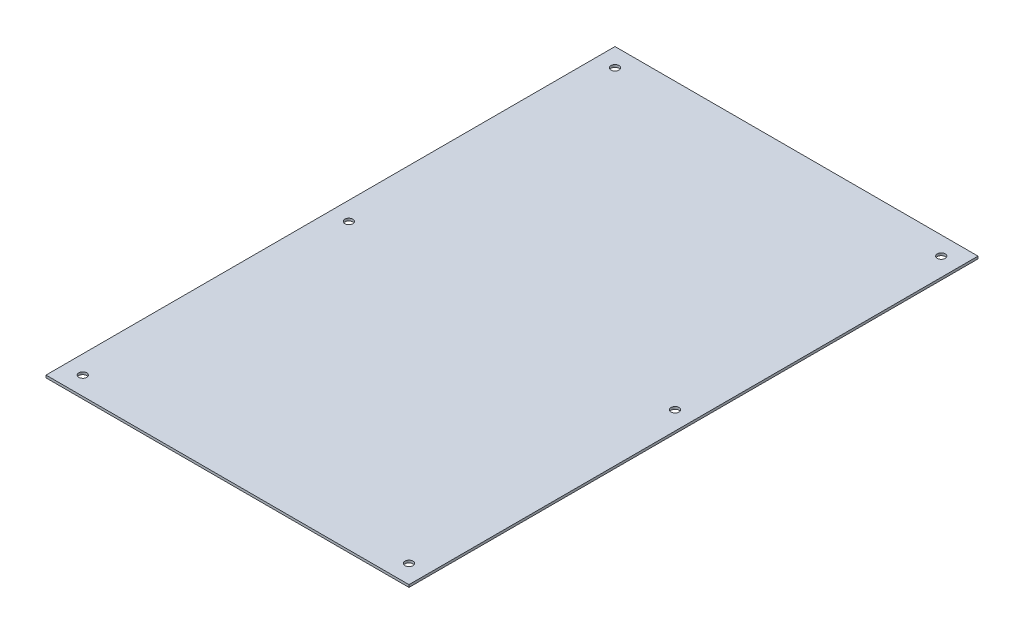
ISO-10303-21;
HEADER;
FILE_DESCRIPTION(('STEP AP214'),'2;1');
FILE_NAME('part.step','',(''),(''),'','','');
FILE_SCHEMA(('AUTOMOTIVE_DESIGN { 1 0 10303 214 1 1 1 1 }'));
ENDSEC;
DATA;
#1=APPLICATION_CONTEXT('core data for automotive mechanical design processes');
#2=APPLICATION_PROTOCOL_DEFINITION('international standard','automotive_design',2000,#1);
#3=PRODUCT_CONTEXT('',#1,'mechanical');
#4=PRODUCT('Part','Part','',(#3));
#5=PRODUCT_RELATED_PRODUCT_CATEGORY('part','',(#4));
#6=PRODUCT_DEFINITION_FORMATION('','',#4);
#7=PRODUCT_DEFINITION_CONTEXT('part definition',#1,'design');
#8=PRODUCT_DEFINITION('design','',#6,#7);
#9=PRODUCT_DEFINITION_SHAPE('','',#8);
#10=(LENGTH_UNIT() NAMED_UNIT(*) SI_UNIT(.MILLI.,.METRE.));
#11=(NAMED_UNIT(*) PLANE_ANGLE_UNIT() SI_UNIT($,.RADIAN.));
#12=(NAMED_UNIT(*) SI_UNIT($,.STERADIAN.) SOLID_ANGLE_UNIT());
#13=UNCERTAINTY_MEASURE_WITH_UNIT(LENGTH_MEASURE(1.E-05),#10,'distance_accuracy_value','');
#14=(GEOMETRIC_REPRESENTATION_CONTEXT(3) GLOBAL_UNCERTAINTY_ASSIGNED_CONTEXT((#13)) GLOBAL_UNIT_ASSIGNED_CONTEXT((#10,
#11,#12)) REPRESENTATION_CONTEXT('',''));
#15=CARTESIAN_POINT('',(0.,0.,0.));
#16=DIRECTION('',(0.,0.,1.));
#17=DIRECTION('',(1.,0.,0.));
#18=AXIS2_PLACEMENT_3D('',#15,#16,#17);
#19=CARTESIAN_POINT('',(148.,2.,232.));
#20=DIRECTION('',(-1.,0.,0.));
#21=DIRECTION('',(0.,0.,1.));
#22=AXIS2_PLACEMENT_3D('',#19,#20,#21);
#23=PLANE('',#22);
#24=DIRECTION('',(0.,0.,-1.));
#25=VECTOR('',#24,1.);
#26=CARTESIAN_POINT('',(148.,0.,232.));
#27=LINE('',#26,#25);
#28=CARTESIAN_POINT('',(148.,0.,232.));
#29=VERTEX_POINT('',#28);
#30=CARTESIAN_POINT('',(148.,0.,-232.));
#31=VERTEX_POINT('',#30);
#32=EDGE_CURVE('E110',#29,#31,#27,.T.);
#33=ORIENTED_EDGE('',*,*,#32,.T.);
#34=DIRECTION('',(0.,-1.,0.));
#35=VECTOR('',#34,1.);
#36=CARTESIAN_POINT('',(148.,2.,-232.));
#37=LINE('',#36,#35);
#38=CARTESIAN_POINT('',(148.,2.,-232.));
#39=VERTEX_POINT('',#38);
#40=EDGE_CURVE('E11',#39,#31,#37,.T.);
#41=ORIENTED_EDGE('',*,*,#40,.F.);
#42=DIRECTION('',(0.,0.,-1.));
#43=VECTOR('',#42,1.);
#44=CARTESIAN_POINT('',(148.,2.,232.));
#45=LINE('',#44,#43);
#46=CARTESIAN_POINT('',(148.,2.,232.));
#47=VERTEX_POINT('',#46);
#48=EDGE_CURVE('E94',#47,#39,#45,.T.);
#49=ORIENTED_EDGE('',*,*,#48,.F.);
#50=DIRECTION('',(0.,-1.,0.));
#51=VECTOR('',#50,1.);
#52=CARTESIAN_POINT('',(148.,2.,232.));
#53=LINE('',#52,#51);
#54=EDGE_CURVE('E106',#47,#29,#53,.T.);
#55=ORIENTED_EDGE('',*,*,#54,.T.);
#56=EDGE_LOOP('',(#33,#41,#49,#55));
#57=FACE_BOUND('',#56,.T.);
#58=ADVANCED_FACE('F42',(#57),#23,.F.);
#59=CARTESIAN_POINT('',(-148.,2.,-232.));
#60=DIRECTION('',(0.,0.,1.));
#61=DIRECTION('',(1.,0.,0.));
#62=AXIS2_PLACEMENT_3D('',#59,#60,#61);
#63=PLANE('',#62);
#64=DIRECTION('',(-1.,0.,0.));
#65=VECTOR('',#64,1.);
#66=CARTESIAN_POINT('',(-148.,0.,-232.));
#67=LINE('',#66,#65);
#68=CARTESIAN_POINT('',(-148.,0.,-232.));
#69=VERTEX_POINT('',#68);
#70=EDGE_CURVE('E99',#31,#69,#67,.T.);
#71=ORIENTED_EDGE('',*,*,#70,.T.);
#72=DIRECTION('',(0.,-1.,0.));
#73=VECTOR('',#72,1.);
#74=CARTESIAN_POINT('',(-148.,2.,-232.));
#75=LINE('',#74,#73);
#76=CARTESIAN_POINT('',(-148.,2.,-232.));
#77=VERTEX_POINT('',#76);
#78=EDGE_CURVE('E51',#77,#69,#75,.T.);
#79=ORIENTED_EDGE('',*,*,#78,.F.);
#80=DIRECTION('',(-1.,0.,0.));
#81=VECTOR('',#80,1.);
#82=CARTESIAN_POINT('',(-148.,2.,-232.));
#83=LINE('',#82,#81);
#84=EDGE_CURVE('E89',#39,#77,#83,.T.);
#85=ORIENTED_EDGE('',*,*,#84,.F.);
#86=ORIENTED_EDGE('',*,*,#40,.T.);
#87=EDGE_LOOP('',(#71,#79,#85,#86));
#88=FACE_BOUND('',#87,.T.);
#89=ADVANCED_FACE('F98',(#88),#63,.F.);
#90=CARTESIAN_POINT('',(-148.,2.,232.));
#91=DIRECTION('',(1.,0.,0.));
#92=DIRECTION('',(0.,0.,-1.));
#93=AXIS2_PLACEMENT_3D('',#90,#91,#92);
#94=PLANE('',#93);
#95=DIRECTION('',(0.,0.,1.));
#96=VECTOR('',#95,1.);
#97=CARTESIAN_POINT('',(-148.,0.,232.));
#98=LINE('',#97,#96);
#99=CARTESIAN_POINT('',(-148.,0.,232.));
#100=VERTEX_POINT('',#99);
#101=EDGE_CURVE('E76',#69,#100,#98,.T.);
#102=ORIENTED_EDGE('',*,*,#101,.T.);
#103=DIRECTION('',(0.,-1.,0.));
#104=VECTOR('',#103,1.);
#105=CARTESIAN_POINT('',(-148.,2.,232.));
#106=LINE('',#105,#104);
#107=CARTESIAN_POINT('',(-148.,2.,232.));
#108=VERTEX_POINT('',#107);
#109=EDGE_CURVE('E101',#108,#100,#106,.T.);
#110=ORIENTED_EDGE('',*,*,#109,.F.);
#111=DIRECTION('',(0.,0.,1.));
#112=VECTOR('',#111,1.);
#113=CARTESIAN_POINT('',(-148.,2.,232.));
#114=LINE('',#113,#112);
#115=EDGE_CURVE('E92',#77,#108,#114,.T.);
#116=ORIENTED_EDGE('',*,*,#115,.F.);
#117=ORIENTED_EDGE('',*,*,#78,.T.);
#118=EDGE_LOOP('',(#102,#110,#116,#117));
#119=FACE_BOUND('',#118,.T.);
#120=ADVANCED_FACE('F102',(#119),#94,.F.);
#121=CARTESIAN_POINT('',(-148.,2.,232.));
#122=DIRECTION('',(0.,0.,-1.));
#123=DIRECTION('',(-1.,0.,0.));
#124=AXIS2_PLACEMENT_3D('',#121,#122,#123);
#125=PLANE('',#124);
#126=DIRECTION('',(1.,0.,0.));
#127=VECTOR('',#126,1.);
#128=CARTESIAN_POINT('',(-148.,0.,232.));
#129=LINE('',#128,#127);
#130=EDGE_CURVE('E82',#100,#29,#129,.T.);
#131=ORIENTED_EDGE('',*,*,#130,.T.);
#132=ORIENTED_EDGE('',*,*,#54,.F.);
#133=DIRECTION('',(1.,0.,0.));
#134=VECTOR('',#133,1.);
#135=CARTESIAN_POINT('',(-148.,2.,232.));
#136=LINE('',#135,#134);
#137=EDGE_CURVE('E59',#108,#47,#136,.T.);
#138=ORIENTED_EDGE('',*,*,#137,.F.);
#139=ORIENTED_EDGE('',*,*,#109,.T.);
#140=EDGE_LOOP('',(#131,#132,#138,#139));
#141=FACE_BOUND('',#140,.T.);
#142=ADVANCED_FACE('F124',(#141),#125,.F.);
#143=CARTESIAN_POINT('',(0.,2.,0.));
#144=DIRECTION('',(0.,-1.,0.));
#145=DIRECTION('',(0.,0.,-1.));
#146=AXIS2_PLACEMENT_3D('',#143,#144,#145);
#147=PLANE('',#146);
#148=CARTESIAN_POINT('',(133.,2.,0.));
#149=DIRECTION('',(0.,1.,0.));
#150=DIRECTION('',(0.,0.,1.));
#151=AXIS2_PLACEMENT_3D('',#148,#149,#150);
#152=CIRCLE('',#151,3.25000000000001);
#153=CARTESIAN_POINT('',(133.,2.,3.25000000000008));
#154=VERTEX_POINT('',#153);
#155=EDGE_CURVE('E159',#154,#154,#152,.T.);
#156=ORIENTED_EDGE('',*,*,#155,.F.);
#157=EDGE_LOOP('',(#156));
#158=FACE_BOUND('',#157,.T.);
#159=CARTESIAN_POINT('',(133.,2.,217.));
#160=DIRECTION('',(0.,1.,0.));
#161=DIRECTION('',(0.,0.,1.));
#162=AXIS2_PLACEMENT_3D('',#159,#160,#161);
#163=CIRCLE('',#162,3.25000000000001);
#164=CARTESIAN_POINT('',(133.,2.,220.25));
#165=VERTEX_POINT('',#164);
#166=EDGE_CURVE('E144',#165,#165,#163,.T.);
#167=ORIENTED_EDGE('',*,*,#166,.F.);
#168=EDGE_LOOP('',(#167));
#169=FACE_BOUND('',#168,.T.);
#170=CARTESIAN_POINT('',(-133.,2.,217.));
#171=DIRECTION('',(0.,1.,0.));
#172=DIRECTION('',(0.,0.,-1.));
#173=AXIS2_PLACEMENT_3D('',#170,#171,#172);
#174=CIRCLE('',#173,3.25000000000001);
#175=CARTESIAN_POINT('',(-133.,2.,213.75));
#176=VERTEX_POINT('',#175);
#177=EDGE_CURVE('E143',#176,#176,#174,.T.);
#178=ORIENTED_EDGE('',*,*,#177,.F.);
#179=EDGE_LOOP('',(#178));
#180=FACE_BOUND('',#179,.T.);
#181=CARTESIAN_POINT('',(133.,2.,-217.));
#182=DIRECTION('',(0.,1.,0.));
#183=DIRECTION('',(0.,0.,-1.));
#184=AXIS2_PLACEMENT_3D('',#181,#182,#183);
#185=CIRCLE('',#184,3.25000000000001);
#186=CARTESIAN_POINT('',(133.,2.,-220.25));
#187=VERTEX_POINT('',#186);
#188=EDGE_CURVE('E135',#187,#187,#185,.T.);
#189=ORIENTED_EDGE('',*,*,#188,.F.);
#190=EDGE_LOOP('',(#189));
#191=FACE_BOUND('',#190,.T.);
#192=CARTESIAN_POINT('',(-133.,2.,0.));
#193=DIRECTION('',(0.,1.,0.));
#194=DIRECTION('',(0.,0.,-1.));
#195=AXIS2_PLACEMENT_3D('',#192,#193,#194);
#196=CIRCLE('',#195,3.25000000000001);
#197=CARTESIAN_POINT('',(-133.,2.,-3.24999999999993));
#198=VERTEX_POINT('',#197);
#199=EDGE_CURVE('E160',#198,#198,#196,.T.);
#200=ORIENTED_EDGE('',*,*,#199,.F.);
#201=EDGE_LOOP('',(#200));
#202=FACE_BOUND('',#201,.T.);
#203=CARTESIAN_POINT('',(-133.,2.,-217.));
#204=DIRECTION('',(0.,1.,0.));
#205=DIRECTION('',(0.,0.,1.));
#206=AXIS2_PLACEMENT_3D('',#203,#204,#205);
#207=CIRCLE('',#206,3.25000000000001);
#208=CARTESIAN_POINT('',(-133.,2.,-213.75));
#209=VERTEX_POINT('',#208);
#210=EDGE_CURVE('E131',#209,#209,#207,.T.);
#211=ORIENTED_EDGE('',*,*,#210,.F.);
#212=EDGE_LOOP('',(#211));
#213=FACE_BOUND('',#212,.T.);
#214=ORIENTED_EDGE('',*,*,#48,.T.);
#215=ORIENTED_EDGE('',*,*,#84,.T.);
#216=ORIENTED_EDGE('',*,*,#115,.T.);
#217=ORIENTED_EDGE('',*,*,#137,.T.);
#218=EDGE_LOOP('',(#214,#215,#216,#217));
#219=FACE_BOUND('',#218,.T.);
#220=ADVANCED_FACE('F90',(#158,#169,#180,#191,#202,#213,#219),#147,.F.);
#221=CARTESIAN_POINT('',(0.,0.,0.));
#222=DIRECTION('',(0.,-1.,0.));
#223=DIRECTION('',(0.,0.,-1.));
#224=AXIS2_PLACEMENT_3D('',#221,#222,#223);
#225=PLANE('',#224);
#226=CARTESIAN_POINT('',(133.,0.,0.));
#227=DIRECTION('',(0.,1.,0.));
#228=DIRECTION('',(0.,0.,1.));
#229=AXIS2_PLACEMENT_3D('',#226,#227,#228);
#230=CIRCLE('',#229,3.25000000000001);
#231=CARTESIAN_POINT('',(133.,0.,3.25000000000008));
#232=VERTEX_POINT('',#231);
#233=EDGE_CURVE('E155',#232,#232,#230,.T.);
#234=ORIENTED_EDGE('',*,*,#233,.T.);
#235=EDGE_LOOP('',(#234));
#236=FACE_BOUND('',#235,.T.);
#237=CARTESIAN_POINT('',(133.,0.,217.));
#238=DIRECTION('',(0.,1.,0.));
#239=DIRECTION('',(0.,0.,1.));
#240=AXIS2_PLACEMENT_3D('',#237,#238,#239);
#241=CIRCLE('',#240,3.25000000000001);
#242=CARTESIAN_POINT('',(133.,0.,220.25));
#243=VERTEX_POINT('',#242);
#244=EDGE_CURVE('E164',#243,#243,#241,.T.);
#245=ORIENTED_EDGE('',*,*,#244,.T.);
#246=EDGE_LOOP('',(#245));
#247=FACE_BOUND('',#246,.T.);
#248=CARTESIAN_POINT('',(-133.,0.,217.));
#249=DIRECTION('',(0.,1.,0.));
#250=DIRECTION('',(0.,0.,-1.));
#251=AXIS2_PLACEMENT_3D('',#248,#249,#250);
#252=CIRCLE('',#251,3.25000000000001);
#253=CARTESIAN_POINT('',(-133.,0.,213.75));
#254=VERTEX_POINT('',#253);
#255=EDGE_CURVE('E139',#254,#254,#252,.T.);
#256=ORIENTED_EDGE('',*,*,#255,.T.);
#257=EDGE_LOOP('',(#256));
#258=FACE_BOUND('',#257,.T.);
#259=CARTESIAN_POINT('',(133.,0.,-217.));
#260=DIRECTION('',(0.,1.,0.));
#261=DIRECTION('',(0.,0.,-1.));
#262=AXIS2_PLACEMENT_3D('',#259,#260,#261);
#263=CIRCLE('',#262,3.25000000000001);
#264=CARTESIAN_POINT('',(133.,0.,-220.25));
#265=VERTEX_POINT('',#264);
#266=EDGE_CURVE('E148',#265,#265,#263,.T.);
#267=ORIENTED_EDGE('',*,*,#266,.T.);
#268=EDGE_LOOP('',(#267));
#269=FACE_BOUND('',#268,.T.);
#270=CARTESIAN_POINT('',(-133.,0.,0.));
#271=DIRECTION('',(0.,1.,0.));
#272=DIRECTION('',(0.,0.,-1.));
#273=AXIS2_PLACEMENT_3D('',#270,#271,#272);
#274=CIRCLE('',#273,3.25000000000001);
#275=CARTESIAN_POINT('',(-133.,0.,-3.24999999999993));
#276=VERTEX_POINT('',#275);
#277=EDGE_CURVE('E171',#276,#276,#274,.T.);
#278=ORIENTED_EDGE('',*,*,#277,.T.);
#279=EDGE_LOOP('',(#278));
#280=FACE_BOUND('',#279,.T.);
#281=CARTESIAN_POINT('',(-133.,0.,-217.));
#282=DIRECTION('',(0.,1.,0.));
#283=DIRECTION('',(0.,0.,1.));
#284=AXIS2_PLACEMENT_3D('',#281,#282,#283);
#285=CIRCLE('',#284,3.25000000000001);
#286=CARTESIAN_POINT('',(-133.,0.,-213.75));
#287=VERTEX_POINT('',#286);
#288=EDGE_CURVE('E114',#287,#287,#285,.T.);
#289=ORIENTED_EDGE('',*,*,#288,.T.);
#290=EDGE_LOOP('',(#289));
#291=FACE_BOUND('',#290,.T.);
#292=ORIENTED_EDGE('',*,*,#32,.F.);
#293=ORIENTED_EDGE('',*,*,#130,.F.);
#294=ORIENTED_EDGE('',*,*,#101,.F.);
#295=ORIENTED_EDGE('',*,*,#70,.F.);
#296=EDGE_LOOP('',(#292,#293,#294,#295));
#297=FACE_BOUND('',#296,.T.);
#298=ADVANCED_FACE('F127',(#236,#247,#258,#269,#280,#291,#297),#225,.T.);
#299=CARTESIAN_POINT('',(-133.,0.,-217.));
#300=DIRECTION('',(0.,1.,0.));
#301=DIRECTION('',(0.,0.,1.));
#302=AXIS2_PLACEMENT_3D('',#299,#300,#301);
#303=CYLINDRICAL_SURFACE('',#302,3.25000000000001);
#304=ORIENTED_EDGE('',*,*,#288,.F.);
#305=EDGE_LOOP('',(#304));
#306=FACE_BOUND('',#305,.T.);
#307=ORIENTED_EDGE('',*,*,#210,.T.);
#308=EDGE_LOOP('',(#307));
#309=FACE_BOUND('',#308,.T.);
#310=ADVANCED_FACE('F187',(#306,#309),#303,.F.);
#311=CARTESIAN_POINT('',(-133.,0.,0.));
#312=DIRECTION('',(0.,1.,0.));
#313=DIRECTION('',(0.,0.,1.));
#314=AXIS2_PLACEMENT_3D('',#311,#312,#313);
#315=CYLINDRICAL_SURFACE('',#314,3.25000000000001);
#316=ORIENTED_EDGE('',*,*,#277,.F.);
#317=EDGE_LOOP('',(#316));
#318=FACE_BOUND('',#317,.T.);
#319=ORIENTED_EDGE('',*,*,#199,.T.);
#320=EDGE_LOOP('',(#319));
#321=FACE_BOUND('',#320,.T.);
#322=ADVANCED_FACE('F179',(#318,#321),#315,.F.);
#323=CARTESIAN_POINT('',(133.,0.,-217.));
#324=DIRECTION('',(0.,1.,0.));
#325=DIRECTION('',(0.,0.,1.));
#326=AXIS2_PLACEMENT_3D('',#323,#324,#325);
#327=CYLINDRICAL_SURFACE('',#326,3.25000000000001);
#328=ORIENTED_EDGE('',*,*,#266,.F.);
#329=EDGE_LOOP('',(#328));
#330=FACE_BOUND('',#329,.T.);
#331=ORIENTED_EDGE('',*,*,#188,.T.);
#332=EDGE_LOOP('',(#331));
#333=FACE_BOUND('',#332,.T.);
#334=ADVANCED_FACE('F195',(#330,#333),#327,.F.);
#335=CARTESIAN_POINT('',(-133.,0.,217.));
#336=DIRECTION('',(0.,1.,0.));
#337=DIRECTION('',(0.,0.,1.));
#338=AXIS2_PLACEMENT_3D('',#335,#336,#337);
#339=CYLINDRICAL_SURFACE('',#338,3.25000000000001);
#340=ORIENTED_EDGE('',*,*,#255,.F.);
#341=EDGE_LOOP('',(#340));
#342=FACE_BOUND('',#341,.T.);
#343=ORIENTED_EDGE('',*,*,#177,.T.);
#344=EDGE_LOOP('',(#343));
#345=FACE_BOUND('',#344,.T.);
#346=ADVANCED_FACE('F246',(#342,#345),#339,.F.);
#347=CARTESIAN_POINT('',(133.,0.,217.));
#348=DIRECTION('',(0.,1.,0.));
#349=DIRECTION('',(0.,0.,1.));
#350=AXIS2_PLACEMENT_3D('',#347,#348,#349);
#351=CYLINDRICAL_SURFACE('',#350,3.25000000000001);
#352=ORIENTED_EDGE('',*,*,#244,.F.);
#353=EDGE_LOOP('',(#352));
#354=FACE_BOUND('',#353,.T.);
#355=ORIENTED_EDGE('',*,*,#166,.T.);
#356=EDGE_LOOP('',(#355));
#357=FACE_BOUND('',#356,.T.);
#358=ADVANCED_FACE('F257',(#354,#357),#351,.F.);
#359=CARTESIAN_POINT('',(133.,0.,0.));
#360=DIRECTION('',(0.,1.,0.));
#361=DIRECTION('',(0.,0.,1.));
#362=AXIS2_PLACEMENT_3D('',#359,#360,#361);
#363=CYLINDRICAL_SURFACE('',#362,3.25000000000001);
#364=ORIENTED_EDGE('',*,*,#233,.F.);
#365=EDGE_LOOP('',(#364));
#366=FACE_BOUND('',#365,.T.);
#367=ORIENTED_EDGE('',*,*,#155,.T.);
#368=EDGE_LOOP('',(#367));
#369=FACE_BOUND('',#368,.T.);
#370=ADVANCED_FACE('F267',(#366,#369),#363,.F.);
#371=CLOSED_SHELL('',(#58,#89,#120,#142,#220,#298,#310,#322,#334,#346,#358,#370));
#372=MANIFOLD_SOLID_BREP('B2',#371);
#373=ADVANCED_BREP_SHAPE_REPRESENTATION('',(#18,#372),#14);
#374=SHAPE_DEFINITION_REPRESENTATION(#9,#373);
ENDSEC;
END-ISO-10303-21;
